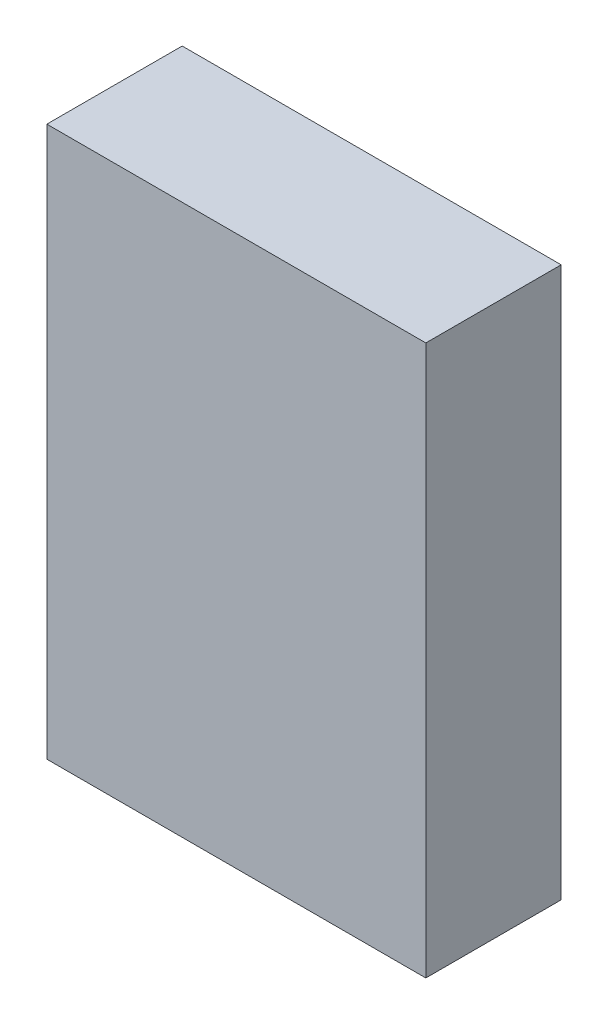
ISO-10303-21;
HEADER;
FILE_DESCRIPTION(('STEP AP214'),'2;1');
FILE_NAME('part.step','',(''),(''),'','','');
FILE_SCHEMA(('AUTOMOTIVE_DESIGN { 1 0 10303 214 1 1 1 1 }'));
ENDSEC;
DATA;
#1=APPLICATION_CONTEXT('core data for automotive mechanical design processes');
#2=APPLICATION_PROTOCOL_DEFINITION('international standard','automotive_design',2000,#1);
#3=PRODUCT_CONTEXT('',#1,'mechanical');
#4=PRODUCT('Part','Part','',(#3));
#5=PRODUCT_RELATED_PRODUCT_CATEGORY('part','',(#4));
#6=PRODUCT_DEFINITION_FORMATION('','',#4);
#7=PRODUCT_DEFINITION_CONTEXT('part definition',#1,'design');
#8=PRODUCT_DEFINITION('design','',#6,#7);
#9=PRODUCT_DEFINITION_SHAPE('','',#8);
#10=(LENGTH_UNIT() NAMED_UNIT(*) SI_UNIT(.MILLI.,.METRE.));
#11=(NAMED_UNIT(*) PLANE_ANGLE_UNIT() SI_UNIT($,.RADIAN.));
#12=(NAMED_UNIT(*) SI_UNIT($,.STERADIAN.) SOLID_ANGLE_UNIT());
#13=UNCERTAINTY_MEASURE_WITH_UNIT(LENGTH_MEASURE(1.E-05),#10,'distance_accuracy_value','');
#14=(GEOMETRIC_REPRESENTATION_CONTEXT(3) GLOBAL_UNCERTAINTY_ASSIGNED_CONTEXT((#13)) GLOBAL_UNIT_ASSIGNED_CONTEXT((#10,
#11,#12)) REPRESENTATION_CONTEXT('',''));
#15=CARTESIAN_POINT('',(0.,0.,0.));
#16=DIRECTION('',(0.,0.,1.));
#17=DIRECTION('',(1.,0.,0.));
#18=AXIS2_PLACEMENT_3D('',#15,#16,#17);
#19=CARTESIAN_POINT('',(-1.3,-2.,1.));
#20=DIRECTION('',(1.,0.,0.));
#21=DIRECTION('',(0.,0.,-1.));
#22=AXIS2_PLACEMENT_3D('',#19,#20,#21);
#23=PLANE('',#22);
#24=DIRECTION('',(0.,-1.,0.));
#25=VECTOR('',#24,1.);
#26=CARTESIAN_POINT('',(-1.3,-2.,0.));
#27=LINE('',#26,#25);
#28=CARTESIAN_POINT('',(-1.3,2.0635,0.));
#29=VERTEX_POINT('',#28);
#30=CARTESIAN_POINT('',(-1.3,-2.,0.));
#31=VERTEX_POINT('',#30);
#32=EDGE_CURVE('E95',#29,#31,#27,.T.);
#33=ORIENTED_EDGE('',*,*,#32,.T.);
#34=DIRECTION('',(0.,0.,-1.));
#35=VECTOR('',#34,1.);
#36=CARTESIAN_POINT('',(-1.3,-2.,1.));
#37=LINE('',#36,#35);
#38=CARTESIAN_POINT('',(-1.3,-2.,1.));
#39=VERTEX_POINT('',#38);
#40=EDGE_CURVE('E11',#39,#31,#37,.T.);
#41=ORIENTED_EDGE('',*,*,#40,.F.);
#42=DIRECTION('',(0.,-1.,0.));
#43=VECTOR('',#42,1.);
#44=CARTESIAN_POINT('',(-1.3,-2.,1.));
#45=LINE('',#44,#43);
#46=CARTESIAN_POINT('',(-1.3,2.0635,1.));
#47=VERTEX_POINT('',#46);
#48=EDGE_CURVE('E83',#47,#39,#45,.T.);
#49=ORIENTED_EDGE('',*,*,#48,.F.);
#50=DIRECTION('',(0.,0.,-1.));
#51=VECTOR('',#50,1.);
#52=CARTESIAN_POINT('',(-1.3,2.0635,1.));
#53=LINE('',#52,#51);
#54=EDGE_CURVE('E91',#47,#29,#53,.T.);
#55=ORIENTED_EDGE('',*,*,#54,.T.);
#56=EDGE_LOOP('',(#33,#41,#49,#55));
#57=FACE_BOUND('',#56,.T.);
#58=ADVANCED_FACE('F32',(#57),#23,.F.);
#59=CARTESIAN_POINT('',(1.5,-2.,1.));
#60=DIRECTION('',(0.,1.,0.));
#61=DIRECTION('',(0.,0.,1.));
#62=AXIS2_PLACEMENT_3D('',#59,#60,#61);
#63=PLANE('',#62);
#64=DIRECTION('',(1.,0.,0.));
#65=VECTOR('',#64,1.);
#66=CARTESIAN_POINT('',(1.5,-2.,0.));
#67=LINE('',#66,#65);
#68=CARTESIAN_POINT('',(1.5,-2.,0.));
#69=VERTEX_POINT('',#68);
#70=EDGE_CURVE('E87',#31,#69,#67,.T.);
#71=ORIENTED_EDGE('',*,*,#70,.T.);
#72=DIRECTION('',(0.,0.,-1.));
#73=VECTOR('',#72,1.);
#74=CARTESIAN_POINT('',(1.5,-2.,1.));
#75=LINE('',#74,#73);
#76=CARTESIAN_POINT('',(1.5,-2.,1.));
#77=VERTEX_POINT('',#76);
#78=EDGE_CURVE('E40',#77,#69,#75,.T.);
#79=ORIENTED_EDGE('',*,*,#78,.F.);
#80=DIRECTION('',(1.,0.,0.));
#81=VECTOR('',#80,1.);
#82=CARTESIAN_POINT('',(1.5,-2.,1.));
#83=LINE('',#82,#81);
#84=EDGE_CURVE('E78',#39,#77,#83,.T.);
#85=ORIENTED_EDGE('',*,*,#84,.F.);
#86=ORIENTED_EDGE('',*,*,#40,.T.);
#87=EDGE_LOOP('',(#71,#79,#85,#86));
#88=FACE_BOUND('',#87,.T.);
#89=ADVANCED_FACE('F86',(#88),#63,.F.);
#90=CARTESIAN_POINT('',(1.5,2.0635,1.));
#91=DIRECTION('',(-1.,0.,0.));
#92=DIRECTION('',(0.,0.,1.));
#93=AXIS2_PLACEMENT_3D('',#90,#91,#92);
#94=PLANE('',#93);
#95=DIRECTION('',(0.,1.,0.));
#96=VECTOR('',#95,1.);
#97=CARTESIAN_POINT('',(1.5,2.0635,0.));
#98=LINE('',#97,#96);
#99=CARTESIAN_POINT('',(1.5,2.0635,0.));
#100=VERTEX_POINT('',#99);
#101=EDGE_CURVE('E65',#69,#100,#98,.T.);
#102=ORIENTED_EDGE('',*,*,#101,.T.);
#103=DIRECTION('',(0.,0.,-1.));
#104=VECTOR('',#103,1.);
#105=CARTESIAN_POINT('',(1.5,2.0635,1.));
#106=LINE('',#105,#104);
#107=CARTESIAN_POINT('',(1.5,2.0635,1.));
#108=VERTEX_POINT('',#107);
#109=EDGE_CURVE('E88',#108,#100,#106,.T.);
#110=ORIENTED_EDGE('',*,*,#109,.F.);
#111=DIRECTION('',(0.,1.,0.));
#112=VECTOR('',#111,1.);
#113=CARTESIAN_POINT('',(1.5,2.0635,1.));
#114=LINE('',#113,#112);
#115=EDGE_CURVE('E81',#77,#108,#114,.T.);
#116=ORIENTED_EDGE('',*,*,#115,.F.);
#117=ORIENTED_EDGE('',*,*,#78,.T.);
#118=EDGE_LOOP('',(#102,#110,#116,#117));
#119=FACE_BOUND('',#118,.T.);
#120=ADVANCED_FACE('F89',(#119),#94,.F.);
#121=CARTESIAN_POINT('',(-1.3,2.0635,1.));
#122=DIRECTION('',(0.,-1.,0.));
#123=DIRECTION('',(0.,0.,-1.));
#124=AXIS2_PLACEMENT_3D('',#121,#122,#123);
#125=PLANE('',#124);
#126=DIRECTION('',(-1.,0.,0.));
#127=VECTOR('',#126,1.);
#128=CARTESIAN_POINT('',(-1.3,2.0635,0.));
#129=LINE('',#128,#127);
#130=EDGE_CURVE('E71',#100,#29,#129,.T.);
#131=ORIENTED_EDGE('',*,*,#130,.T.);
#132=ORIENTED_EDGE('',*,*,#54,.F.);
#133=DIRECTION('',(-1.,0.,0.));
#134=VECTOR('',#133,1.);
#135=CARTESIAN_POINT('',(-1.3,2.0635,1.));
#136=LINE('',#135,#134);
#137=EDGE_CURVE('E48',#108,#47,#136,.T.);
#138=ORIENTED_EDGE('',*,*,#137,.F.);
#139=ORIENTED_EDGE('',*,*,#109,.T.);
#140=EDGE_LOOP('',(#131,#132,#138,#139));
#141=FACE_BOUND('',#140,.T.);
#142=ADVANCED_FACE('F102',(#141),#125,.F.);
#143=CARTESIAN_POINT('',(0.,0.,1.));
#144=DIRECTION('',(0.,0.,-1.));
#145=DIRECTION('',(-1.,0.,0.));
#146=AXIS2_PLACEMENT_3D('',#143,#144,#145);
#147=PLANE('',#146);
#148=ORIENTED_EDGE('',*,*,#48,.T.);
#149=ORIENTED_EDGE('',*,*,#84,.T.);
#150=ORIENTED_EDGE('',*,*,#115,.T.);
#151=ORIENTED_EDGE('',*,*,#137,.T.);
#152=EDGE_LOOP('',(#148,#149,#150,#151));
#153=FACE_BOUND('',#152,.T.);
#154=ADVANCED_FACE('F79',(#153),#147,.F.);
#155=CARTESIAN_POINT('',(0.,0.,0.));
#156=DIRECTION('',(0.,0.,-1.));
#157=DIRECTION('',(-1.,0.,0.));
#158=AXIS2_PLACEMENT_3D('',#155,#156,#157);
#159=PLANE('',#158);
#160=ORIENTED_EDGE('',*,*,#32,.F.);
#161=ORIENTED_EDGE('',*,*,#130,.F.);
#162=ORIENTED_EDGE('',*,*,#101,.F.);
#163=ORIENTED_EDGE('',*,*,#70,.F.);
#164=EDGE_LOOP('',(#160,#161,#162,#163));
#165=FACE_BOUND('',#164,.T.);
#166=ADVANCED_FACE('F105',(#165),#159,.T.);
#167=CLOSED_SHELL('',(#58,#89,#120,#142,#154,#166));
#168=MANIFOLD_SOLID_BREP('B2',#167);
#169=ADVANCED_BREP_SHAPE_REPRESENTATION('',(#18,#168),#14);
#170=SHAPE_DEFINITION_REPRESENTATION(#9,#169);
ENDSEC;
END-ISO-10303-21;
